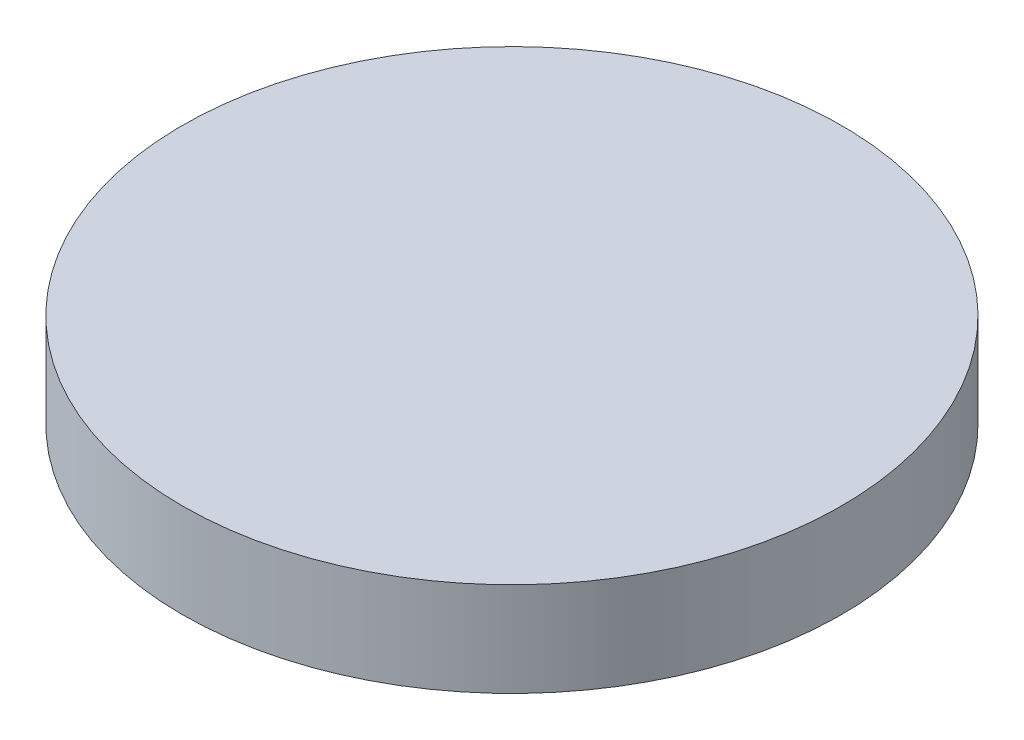
ISO-10303-21;
HEADER;
FILE_DESCRIPTION(('STEP AP214'),'2;1');
FILE_NAME('part.step','',(''),(''),'','','');
FILE_SCHEMA(('AUTOMOTIVE_DESIGN { 1 0 10303 214 1 1 1 1 }'));
ENDSEC;
DATA;
#1=APPLICATION_CONTEXT('core data for automotive mechanical design processes');
#2=APPLICATION_PROTOCOL_DEFINITION('international standard','automotive_design',2000,#1);
#3=PRODUCT_CONTEXT('',#1,'mechanical');
#4=PRODUCT('Part','Part','',(#3));
#5=PRODUCT_RELATED_PRODUCT_CATEGORY('part','',(#4));
#6=PRODUCT_DEFINITION_FORMATION('','',#4);
#7=PRODUCT_DEFINITION_CONTEXT('part definition',#1,'design');
#8=PRODUCT_DEFINITION('design','',#6,#7);
#9=PRODUCT_DEFINITION_SHAPE('','',#8);
#10=(LENGTH_UNIT() NAMED_UNIT(*) SI_UNIT(.MILLI.,.METRE.));
#11=(NAMED_UNIT(*) PLANE_ANGLE_UNIT() SI_UNIT($,.RADIAN.));
#12=(NAMED_UNIT(*) SI_UNIT($,.STERADIAN.) SOLID_ANGLE_UNIT());
#13=UNCERTAINTY_MEASURE_WITH_UNIT(LENGTH_MEASURE(1.E-05),#10,'distance_accuracy_value','');
#14=(GEOMETRIC_REPRESENTATION_CONTEXT(3) GLOBAL_UNCERTAINTY_ASSIGNED_CONTEXT((#13)) GLOBAL_UNIT_ASSIGNED_CONTEXT((#10,
#11,#12)) REPRESENTATION_CONTEXT('',''));
#15=CARTESIAN_POINT('',(0.,0.,0.));
#16=DIRECTION('',(0.,0.,1.));
#17=DIRECTION('',(1.,0.,0.));
#18=AXIS2_PLACEMENT_3D('',#15,#16,#17);
#19=CARTESIAN_POINT('',(0.,6.,0.));
#20=DIRECTION('',(0.,-1.,0.));
#21=DIRECTION('',(0.,0.,-1.));
#22=AXIS2_PLACEMENT_3D('',#19,#20,#21);
#23=PLANE('',#22);
#24=CARTESIAN_POINT('',(0.,6.,0.));
#25=DIRECTION('',(0.,1.,0.));
#26=DIRECTION('',(0.,0.,1.));
#27=AXIS2_PLACEMENT_3D('',#24,#25,#26);
#28=CIRCLE('',#27,10.5);
#29=CARTESIAN_POINT('',(0.,6.,10.5));
#30=VERTEX_POINT('',#29);
#31=EDGE_CURVE('E64',#30,#30,#28,.T.);
#32=ORIENTED_EDGE('',*,*,#31,.T.);
#33=EDGE_LOOP('',(#32));
#34=FACE_BOUND('',#33,.T.);
#35=ADVANCED_FACE('F37',(#34),#23,.F.);
#36=CARTESIAN_POINT('',(0.,3.,0.));
#37=DIRECTION('',(0.,-1.,0.));
#38=DIRECTION('',(0.,0.,-1.));
#39=AXIS2_PLACEMENT_3D('',#36,#37,#38);
#40=PLANE('',#39);
#41=CARTESIAN_POINT('',(0.,3.,0.));
#42=DIRECTION('',(0.,1.,0.));
#43=DIRECTION('',(0.,0.,1.));
#44=AXIS2_PLACEMENT_3D('',#41,#42,#43);
#45=CIRCLE('',#44,3.);
#46=CARTESIAN_POINT('',(0.,3.,3.));
#47=VERTEX_POINT('',#46);
#48=EDGE_CURVE('E10',#47,#47,#45,.T.);
#49=ORIENTED_EDGE('',*,*,#48,.F.);
#50=EDGE_LOOP('',(#49));
#51=FACE_BOUND('',#50,.T.);
#52=ADVANCED_FACE('F81',(#51),#40,.T.);
#53=CARTESIAN_POINT('',(0.,0.,0.));
#54=DIRECTION('',(0.,1.,0.));
#55=DIRECTION('',(0.,0.,1.));
#56=AXIS2_PLACEMENT_3D('',#53,#54,#55);
#57=CYLINDRICAL_SURFACE('',#56,3.);
#58=CARTESIAN_POINT('',(0.,0.,0.));
#59=DIRECTION('',(0.,1.,0.));
#60=DIRECTION('',(0.,0.,1.));
#61=AXIS2_PLACEMENT_3D('',#58,#59,#60);
#62=CIRCLE('',#61,3.);
#63=CARTESIAN_POINT('',(0.,0.,3.));
#64=VERTEX_POINT('',#63);
#65=EDGE_CURVE('E44',#64,#64,#62,.T.);
#66=ORIENTED_EDGE('',*,*,#65,.F.);
#67=EDGE_LOOP('',(#66));
#68=FACE_BOUND('',#67,.T.);
#69=ORIENTED_EDGE('',*,*,#48,.T.);
#70=EDGE_LOOP('',(#69));
#71=FACE_BOUND('',#70,.T.);
#72=ADVANCED_FACE('F89',(#68,#71),#57,.F.);
#73=CARTESIAN_POINT('',(0.,0.,0.));
#74=DIRECTION('',(0.,1.,0.));
#75=DIRECTION('',(0.,0.,1.));
#76=AXIS2_PLACEMENT_3D('',#73,#74,#75);
#77=PLANE('',#76);
#78=CARTESIAN_POINT('',(0.,0.,0.));
#79=DIRECTION('',(0.,1.,0.));
#80=DIRECTION('',(0.,0.,1.));
#81=AXIS2_PLACEMENT_3D('',#78,#79,#80);
#82=CIRCLE('',#81,4.5);
#83=CARTESIAN_POINT('',(0.,0.,4.5));
#84=VERTEX_POINT('',#83);
#85=EDGE_CURVE('E49',#84,#84,#82,.T.);
#86=ORIENTED_EDGE('',*,*,#85,.F.);
#87=EDGE_LOOP('',(#86));
#88=FACE_BOUND('',#87,.T.);
#89=ORIENTED_EDGE('',*,*,#65,.T.);
#90=EDGE_LOOP('',(#89));
#91=FACE_BOUND('',#90,.T.);
#92=ADVANCED_FACE('F85',(#88,#91),#77,.F.);
#93=CARTESIAN_POINT('',(0.,0.,0.));
#94=DIRECTION('',(0.,1.,0.));
#95=DIRECTION('',(0.,0.,1.));
#96=AXIS2_PLACEMENT_3D('',#93,#94,#95);
#97=CYLINDRICAL_SURFACE('',#96,4.5);
#98=CARTESIAN_POINT('',(0.,3.,0.));
#99=DIRECTION('',(0.,1.,0.));
#100=DIRECTION('',(0.,0.,1.));
#101=AXIS2_PLACEMENT_3D('',#98,#99,#100);
#102=CIRCLE('',#101,4.5);
#103=CARTESIAN_POINT('',(0.,3.,4.5));
#104=VERTEX_POINT('',#103);
#105=EDGE_CURVE('E54',#104,#104,#102,.T.);
#106=ORIENTED_EDGE('',*,*,#105,.F.);
#107=EDGE_LOOP('',(#106));
#108=FACE_BOUND('',#107,.T.);
#109=ORIENTED_EDGE('',*,*,#85,.T.);
#110=EDGE_LOOP('',(#109));
#111=FACE_BOUND('',#110,.T.);
#112=ADVANCED_FACE('F78',(#108,#111),#97,.T.);
#113=ORIENTED_EDGE('',*,*,#105,.T.);
#114=EDGE_LOOP('',(#113));
#115=FACE_BOUND('',#114,.T.);
#116=CARTESIAN_POINT('',(0.,3.,0.));
#117=DIRECTION('',(0.,1.,0.));
#118=DIRECTION('',(0.,0.,1.));
#119=AXIS2_PLACEMENT_3D('',#116,#117,#118);
#120=CIRCLE('',#119,10.5);
#121=CARTESIAN_POINT('',(0.,3.,10.5));
#122=VERTEX_POINT('',#121);
#123=EDGE_CURVE('E60',#122,#122,#120,.T.);
#124=ORIENTED_EDGE('',*,*,#123,.F.);
#125=EDGE_LOOP('',(#124));
#126=FACE_BOUND('',#125,.T.);
#127=ADVANCED_FACE('F73',(#115,#126),#40,.T.);
#128=CARTESIAN_POINT('',(0.,0.,0.));
#129=DIRECTION('',(0.,1.,0.));
#130=DIRECTION('',(0.,0.,1.));
#131=AXIS2_PLACEMENT_3D('',#128,#129,#130);
#132=CYLINDRICAL_SURFACE('',#131,10.5);
#133=ORIENTED_EDGE('',*,*,#31,.F.);
#134=EDGE_LOOP('',(#133));
#135=FACE_BOUND('',#134,.T.);
#136=ORIENTED_EDGE('',*,*,#123,.T.);
#137=EDGE_LOOP('',(#136));
#138=FACE_BOUND('',#137,.T.);
#139=ADVANCED_FACE('F70',(#135,#138),#132,.T.);
#140=CLOSED_SHELL('',(#35,#52,#72,#92,#112,#127,#139));
#141=MANIFOLD_SOLID_BREP('B2',#140);
#142=ADVANCED_BREP_SHAPE_REPRESENTATION('',(#18,#141),#14);
#143=SHAPE_DEFINITION_REPRESENTATION(#9,#142);
ENDSEC;
END-ISO-10303-21;
